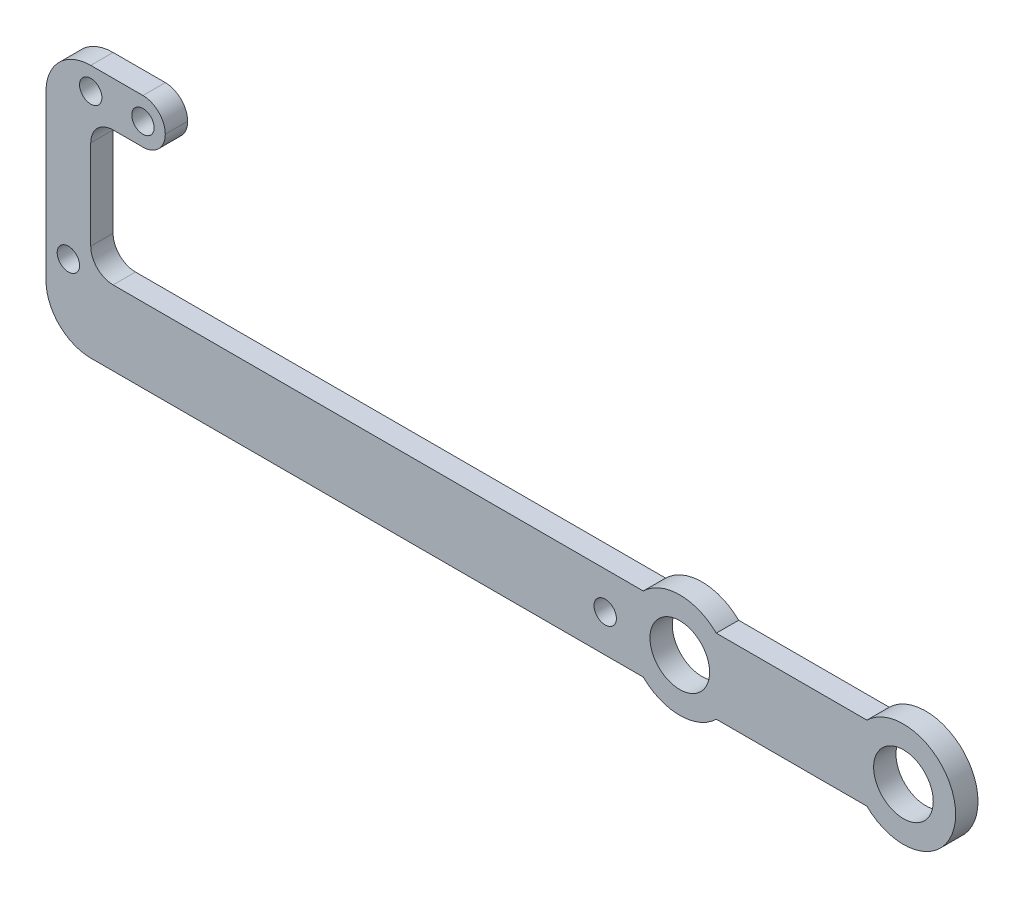
ISO-10303-21;
HEADER;
FILE_DESCRIPTION(('STEP AP214'),'2;1');
FILE_NAME('part.step','',(''),(''),'','','');
FILE_SCHEMA(('AUTOMOTIVE_DESIGN { 1 0 10303 214 1 1 1 1 }'));
ENDSEC;
DATA;
#1=APPLICATION_CONTEXT('core data for automotive mechanical design processes');
#2=APPLICATION_PROTOCOL_DEFINITION('international standard','automotive_design',2000,#1);
#3=PRODUCT_CONTEXT('',#1,'mechanical');
#4=PRODUCT('Part','Part','',(#3));
#5=PRODUCT_RELATED_PRODUCT_CATEGORY('part','',(#4));
#6=PRODUCT_DEFINITION_FORMATION('','',#4);
#7=PRODUCT_DEFINITION_CONTEXT('part definition',#1,'design');
#8=PRODUCT_DEFINITION('design','',#6,#7);
#9=PRODUCT_DEFINITION_SHAPE('','',#8);
#10=(LENGTH_UNIT() NAMED_UNIT(*) SI_UNIT(.MILLI.,.METRE.));
#11=(NAMED_UNIT(*) PLANE_ANGLE_UNIT() SI_UNIT($,.RADIAN.));
#12=(NAMED_UNIT(*) SI_UNIT($,.STERADIAN.) SOLID_ANGLE_UNIT());
#13=UNCERTAINTY_MEASURE_WITH_UNIT(LENGTH_MEASURE(1.E-05),#10,'distance_accuracy_value','');
#14=(GEOMETRIC_REPRESENTATION_CONTEXT(3) GLOBAL_UNCERTAINTY_ASSIGNED_CONTEXT((#13)) GLOBAL_UNIT_ASSIGNED_CONTEXT((#10,
#11,#12)) REPRESENTATION_CONTEXT('',''));
#15=CARTESIAN_POINT('',(0.,0.,0.));
#16=DIRECTION('',(0.,0.,1.));
#17=DIRECTION('',(1.,0.,0.));
#18=AXIS2_PLACEMENT_3D('',#15,#16,#17);
#19=CARTESIAN_POINT('',(0.,0.,3.));
#20=DIRECTION('',(1.,0.,0.));
#21=DIRECTION('',(0.,0.,-1.));
#22=AXIS2_PLACEMENT_3D('',#19,#20,#21);
#23=PLANE('',#22);
#24=DIRECTION('',(0.,-1.,0.));
#25=VECTOR('',#24,1.);
#26=CARTESIAN_POINT('',(0.,0.,0.));
#27=LINE('',#26,#25);
#28=CARTESIAN_POINT('',(0.,28.,0.));
#29=VERTEX_POINT('',#28);
#30=CARTESIAN_POINT('',(0.,6.,0.));
#31=VERTEX_POINT('',#30);
#32=EDGE_CURVE('E206',#29,#31,#27,.T.);
#33=ORIENTED_EDGE('',*,*,#32,.T.);
#34=DIRECTION('',(0.,0.,-1.));
#35=VECTOR('',#34,1.);
#36=CARTESIAN_POINT('',(0.,6.,3.));
#37=LINE('',#36,#35);
#38=CARTESIAN_POINT('',(0.,6.,3.));
#39=VERTEX_POINT('',#38);
#40=EDGE_CURVE('E59',#31,#39,#37,.F.);
#41=ORIENTED_EDGE('',*,*,#40,.T.);
#42=DIRECTION('',(0.,-1.,0.));
#43=VECTOR('',#42,1.);
#44=CARTESIAN_POINT('',(0.,0.,3.));
#45=LINE('',#44,#43);
#46=CARTESIAN_POINT('',(0.,28.,3.));
#47=VERTEX_POINT('',#46);
#48=EDGE_CURVE('E168',#47,#39,#45,.T.);
#49=ORIENTED_EDGE('',*,*,#48,.F.);
#50=DIRECTION('',(0.,0.,-1.));
#51=VECTOR('',#50,1.);
#52=CARTESIAN_POINT('',(0.,28.,3.));
#53=LINE('',#52,#51);
#54=EDGE_CURVE('E285',#47,#29,#53,.T.);
#55=ORIENTED_EDGE('',*,*,#54,.T.);
#56=EDGE_LOOP('',(#33,#41,#49,#55));
#57=FACE_BOUND('',#56,.T.);
#58=ADVANCED_FACE('F37',(#57),#23,.F.);
#59=CARTESIAN_POINT('',(0.,0.,3.));
#60=DIRECTION('',(0.,1.,0.));
#61=DIRECTION('',(0.,0.,1.));
#62=AXIS2_PLACEMENT_3D('',#59,#60,#61);
#63=PLANE('',#62);
#64=DIRECTION('',(1.,0.,0.));
#65=VECTOR('',#64,1.);
#66=CARTESIAN_POINT('',(0.,0.,3.));
#67=LINE('',#66,#65);
#68=CARTESIAN_POINT('',(6.,0.,3.));
#69=VERTEX_POINT('',#68);
#70=CARTESIAN_POINT('',(80.1010205144337,0.,3.));
#71=VERTEX_POINT('',#70);
#72=EDGE_CURVE('E158',#69,#71,#67,.T.);
#73=ORIENTED_EDGE('',*,*,#72,.F.);
#74=DIRECTION('',(0.,0.,-1.));
#75=VECTOR('',#74,1.);
#76=CARTESIAN_POINT('',(6.,0.,3.));
#77=LINE('',#76,#75);
#78=CARTESIAN_POINT('',(6.,0.,0.));
#79=VERTEX_POINT('',#78);
#80=EDGE_CURVE('E276',#69,#79,#77,.T.);
#81=ORIENTED_EDGE('',*,*,#80,.T.);
#82=DIRECTION('',(1.,0.,0.));
#83=VECTOR('',#82,1.);
#84=CARTESIAN_POINT('',(0.,0.,0.));
#85=LINE('',#84,#83);
#86=CARTESIAN_POINT('',(80.1010205144337,0.,0.));
#87=VERTEX_POINT('',#86);
#88=EDGE_CURVE('E174',#79,#87,#85,.T.);
#89=ORIENTED_EDGE('',*,*,#88,.T.);
#90=DIRECTION('',(0.,0.,-1.));
#91=VECTOR('',#90,1.);
#92=CARTESIAN_POINT('',(80.1010205144337,0.,3.));
#93=LINE('',#92,#91);
#94=EDGE_CURVE('E171',#71,#87,#93,.T.);
#95=ORIENTED_EDGE('',*,*,#94,.F.);
#96=EDGE_LOOP('',(#73,#81,#89,#95));
#97=FACE_BOUND('',#96,.T.);
#98=ADVANCED_FACE('F172',(#97),#63,.F.);
#99=CARTESIAN_POINT('',(85.,5.,3.));
#100=DIRECTION('',(0.,0.,-1.));
#101=DIRECTION('',(-1.,0.,0.));
#102=AXIS2_PLACEMENT_3D('',#99,#100,#101);
#103=CYLINDRICAL_SURFACE('',#102,7.);
#104=CARTESIAN_POINT('',(85.,5.,0.));
#105=DIRECTION('',(0.,0.,1.));
#106=DIRECTION('',(1.,0.,0.));
#107=AXIS2_PLACEMENT_3D('',#104,#105,#106);
#108=CIRCLE('',#107,7.);
#109=CARTESIAN_POINT('',(89.8989794855664,0.,0.));
#110=VERTEX_POINT('',#109);
#111=EDGE_CURVE('E210',#87,#110,#108,.T.);
#112=ORIENTED_EDGE('',*,*,#111,.T.);
#113=DIRECTION('',(0.,0.,-1.));
#114=VECTOR('',#113,1.);
#115=CARTESIAN_POINT('',(89.8989794855664,0.,3.));
#116=LINE('',#115,#114);
#117=CARTESIAN_POINT('',(89.8989794855664,0.,3.));
#118=VERTEX_POINT('',#117);
#119=EDGE_CURVE('E178',#118,#110,#116,.T.);
#120=ORIENTED_EDGE('',*,*,#119,.F.);
#121=CARTESIAN_POINT('',(85.,5.,3.));
#122=DIRECTION('',(0.,0.,1.));
#123=DIRECTION('',(1.,0.,0.));
#124=AXIS2_PLACEMENT_3D('',#121,#122,#123);
#125=CIRCLE('',#124,7.);
#126=EDGE_CURVE('E162',#71,#118,#125,.T.);
#127=ORIENTED_EDGE('',*,*,#126,.F.);
#128=ORIENTED_EDGE('',*,*,#94,.T.);
#129=EDGE_LOOP('',(#112,#120,#127,#128));
#130=FACE_BOUND('',#129,.T.);
#131=ADVANCED_FACE('F180',(#130),#103,.T.);
#132=CARTESIAN_POINT('',(89.8989794855664,0.,3.));
#133=DIRECTION('',(0.,1.,0.));
#134=DIRECTION('',(-1.,0.,0.));
#135=AXIS2_PLACEMENT_3D('',#132,#133,#134);
#136=PLANE('',#135);
#137=DIRECTION('',(1.,0.,0.));
#138=VECTOR('',#137,1.);
#139=CARTESIAN_POINT('',(89.8989794855664,0.,0.));
#140=LINE('',#139,#138);
#141=CARTESIAN_POINT('',(110.101020514434,0.,0.));
#142=VERTEX_POINT('',#141);
#143=EDGE_CURVE('E212',#110,#142,#140,.T.);
#144=ORIENTED_EDGE('',*,*,#143,.T.);
#145=DIRECTION('',(0.,0.,-1.));
#146=VECTOR('',#145,1.);
#147=CARTESIAN_POINT('',(110.101020514434,0.,3.));
#148=LINE('',#147,#146);
#149=CARTESIAN_POINT('',(110.101020514434,0.,3.));
#150=VERTEX_POINT('',#149);
#151=EDGE_CURVE('E239',#150,#142,#148,.T.);
#152=ORIENTED_EDGE('',*,*,#151,.F.);
#153=DIRECTION('',(1.,0.,0.));
#154=VECTOR('',#153,1.);
#155=CARTESIAN_POINT('',(89.8989794855664,0.,3.));
#156=LINE('',#155,#154);
#157=EDGE_CURVE('E183',#118,#150,#156,.T.);
#158=ORIENTED_EDGE('',*,*,#157,.F.);
#159=ORIENTED_EDGE('',*,*,#119,.T.);
#160=EDGE_LOOP('',(#144,#152,#158,#159));
#161=FACE_BOUND('',#160,.T.);
#162=ADVANCED_FACE('F349',(#161),#136,.F.);
#163=CARTESIAN_POINT('',(115.,5.,3.));
#164=DIRECTION('',(0.,0.,-1.));
#165=DIRECTION('',(-1.,0.,0.));
#166=AXIS2_PLACEMENT_3D('',#163,#164,#165);
#167=CYLINDRICAL_SURFACE('',#166,7.);
#168=CARTESIAN_POINT('',(115.,5.,0.));
#169=DIRECTION('',(0.,0.,1.));
#170=DIRECTION('',(1.,0.,0.));
#171=AXIS2_PLACEMENT_3D('',#168,#169,#170);
#172=CIRCLE('',#171,7.);
#173=CARTESIAN_POINT('',(110.101020514434,10.,0.));
#174=VERTEX_POINT('',#173);
#175=EDGE_CURVE('E214',#142,#174,#172,.T.);
#176=ORIENTED_EDGE('',*,*,#175,.T.);
#177=DIRECTION('',(0.,0.,-1.));
#178=VECTOR('',#177,1.);
#179=CARTESIAN_POINT('',(110.101020514434,10.,3.));
#180=LINE('',#179,#178);
#181=CARTESIAN_POINT('',(110.101020514434,10.,3.));
#182=VERTEX_POINT('',#181);
#183=EDGE_CURVE('E236',#182,#174,#180,.T.);
#184=ORIENTED_EDGE('',*,*,#183,.F.);
#185=CARTESIAN_POINT('',(115.,5.,3.));
#186=DIRECTION('',(0.,0.,1.));
#187=DIRECTION('',(1.,0.,0.));
#188=AXIS2_PLACEMENT_3D('',#185,#186,#187);
#189=CIRCLE('',#188,7.);
#190=EDGE_CURVE('E185',#150,#182,#189,.T.);
#191=ORIENTED_EDGE('',*,*,#190,.F.);
#192=ORIENTED_EDGE('',*,*,#151,.T.);
#193=EDGE_LOOP('',(#176,#184,#191,#192));
#194=FACE_BOUND('',#193,.T.);
#195=ADVANCED_FACE('F346',(#194),#167,.T.);
#196=CARTESIAN_POINT('',(110.101020514434,10.,3.));
#197=DIRECTION('',(0.,-1.,0.));
#198=DIRECTION('',(1.,0.,0.));
#199=AXIS2_PLACEMENT_3D('',#196,#197,#198);
#200=PLANE('',#199);
#201=DIRECTION('',(-1.,0.,0.));
#202=VECTOR('',#201,1.);
#203=CARTESIAN_POINT('',(110.101020514434,10.,0.));
#204=LINE('',#203,#202);
#205=CARTESIAN_POINT('',(89.8989794855664,10.,0.));
#206=VERTEX_POINT('',#205);
#207=EDGE_CURVE('E216',#174,#206,#204,.T.);
#208=ORIENTED_EDGE('',*,*,#207,.T.);
#209=DIRECTION('',(0.,0.,-1.));
#210=VECTOR('',#209,1.);
#211=CARTESIAN_POINT('',(89.8989794855664,10.,3.));
#212=LINE('',#211,#210);
#213=CARTESIAN_POINT('',(89.8989794855664,10.,3.));
#214=VERTEX_POINT('',#213);
#215=EDGE_CURVE('E233',#214,#206,#212,.T.);
#216=ORIENTED_EDGE('',*,*,#215,.F.);
#217=DIRECTION('',(-1.,0.,0.));
#218=VECTOR('',#217,1.);
#219=CARTESIAN_POINT('',(110.101020514434,10.,3.));
#220=LINE('',#219,#218);
#221=EDGE_CURVE('E190',#182,#214,#220,.T.);
#222=ORIENTED_EDGE('',*,*,#221,.F.);
#223=ORIENTED_EDGE('',*,*,#183,.T.);
#224=EDGE_LOOP('',(#208,#216,#222,#223));
#225=FACE_BOUND('',#224,.T.);
#226=ADVANCED_FACE('F341',(#225),#200,.F.);
#227=CARTESIAN_POINT('',(85.,5.,3.));
#228=DIRECTION('',(0.,0.,-1.));
#229=DIRECTION('',(-1.,0.,0.));
#230=AXIS2_PLACEMENT_3D('',#227,#228,#229);
#231=CYLINDRICAL_SURFACE('',#230,7.);
#232=CARTESIAN_POINT('',(85.,5.,0.));
#233=DIRECTION('',(0.,0.,1.));
#234=DIRECTION('',(1.,0.,0.));
#235=AXIS2_PLACEMENT_3D('',#232,#233,#234);
#236=CIRCLE('',#235,7.);
#237=CARTESIAN_POINT('',(80.1010205144336,10.,0.));
#238=VERTEX_POINT('',#237);
#239=EDGE_CURVE('E218',#206,#238,#236,.T.);
#240=ORIENTED_EDGE('',*,*,#239,.T.);
#241=DIRECTION('',(0.,0.,-1.));
#242=VECTOR('',#241,1.);
#243=CARTESIAN_POINT('',(80.1010205144336,10.,3.));
#244=LINE('',#243,#242);
#245=CARTESIAN_POINT('',(80.1010205144336,10.,3.));
#246=VERTEX_POINT('',#245);
#247=EDGE_CURVE('E205',#246,#238,#244,.T.);
#248=ORIENTED_EDGE('',*,*,#247,.F.);
#249=CARTESIAN_POINT('',(85.,5.,3.));
#250=DIRECTION('',(0.,0.,1.));
#251=DIRECTION('',(1.,0.,0.));
#252=AXIS2_PLACEMENT_3D('',#249,#250,#251);
#253=CIRCLE('',#252,7.);
#254=EDGE_CURVE('E192',#214,#246,#253,.T.);
#255=ORIENTED_EDGE('',*,*,#254,.F.);
#256=ORIENTED_EDGE('',*,*,#215,.T.);
#257=EDGE_LOOP('',(#240,#248,#255,#256));
#258=FACE_BOUND('',#257,.T.);
#259=ADVANCED_FACE('F335',(#258),#231,.T.);
#260=CARTESIAN_POINT('',(80.1010205144336,10.,3.));
#261=DIRECTION('',(0.,-1.,0.));
#262=DIRECTION('',(1.,0.,0.));
#263=AXIS2_PLACEMENT_3D('',#260,#261,#262);
#264=PLANE('',#263);
#265=DIRECTION('',(-1.,0.,0.));
#266=VECTOR('',#265,1.);
#267=CARTESIAN_POINT('',(80.1010205144336,10.,0.));
#268=LINE('',#267,#266);
#269=CARTESIAN_POINT('',(9.00000000000004,9.99999999999999,0.));
#270=VERTEX_POINT('',#269);
#271=EDGE_CURVE('E220',#238,#270,#268,.T.);
#272=ORIENTED_EDGE('',*,*,#271,.T.);
#273=DIRECTION('',(0.,0.,-1.));
#274=VECTOR('',#273,1.);
#275=CARTESIAN_POINT('',(9.00000000000001,9.99999999999999,3.));
#276=LINE('',#275,#274);
#277=CARTESIAN_POINT('',(9.00000000000004,9.99999999999999,3.));
#278=VERTEX_POINT('',#277);
#279=EDGE_CURVE('E250',#270,#278,#276,.F.);
#280=ORIENTED_EDGE('',*,*,#279,.T.);
#281=DIRECTION('',(-1.,0.,0.));
#282=VECTOR('',#281,1.);
#283=CARTESIAN_POINT('',(80.1010205144336,10.,3.));
#284=LINE('',#283,#282);
#285=EDGE_CURVE('E194',#246,#278,#284,.T.);
#286=ORIENTED_EDGE('',*,*,#285,.F.);
#287=ORIENTED_EDGE('',*,*,#247,.T.);
#288=EDGE_LOOP('',(#272,#280,#286,#287));
#289=FACE_BOUND('',#288,.T.);
#290=ADVANCED_FACE('F330',(#289),#264,.F.);
#291=CARTESIAN_POINT('',(6.,28.,3.));
#292=DIRECTION('',(-1.,0.,0.));
#293=DIRECTION('',(0.,-1.,0.));
#294=AXIS2_PLACEMENT_3D('',#291,#292,#293);
#295=PLANE('',#294);
#296=DIRECTION('',(0.,1.,0.));
#297=VECTOR('',#296,1.);
#298=CARTESIAN_POINT('',(6.,28.,3.));
#299=LINE('',#298,#297);
#300=CARTESIAN_POINT('',(6.00000000000001,13.,3.));
#301=VERTEX_POINT('',#300);
#302=CARTESIAN_POINT('',(6.,25.,3.));
#303=VERTEX_POINT('',#302);
#304=EDGE_CURVE('E197',#301,#303,#299,.T.);
#305=ORIENTED_EDGE('',*,*,#304,.F.);
#306=DIRECTION('',(0.,0.,-1.));
#307=VECTOR('',#306,1.);
#308=CARTESIAN_POINT('',(6.00000000000001,13.,0.));
#309=LINE('',#308,#307);
#310=CARTESIAN_POINT('',(6.00000000000001,13.,0.));
#311=VERTEX_POINT('',#310);
#312=EDGE_CURVE('E247',#301,#311,#309,.T.);
#313=ORIENTED_EDGE('',*,*,#312,.T.);
#314=DIRECTION('',(0.,1.,0.));
#315=VECTOR('',#314,1.);
#316=CARTESIAN_POINT('',(6.,28.,0.));
#317=LINE('',#316,#315);
#318=CARTESIAN_POINT('',(6.,25.,0.));
#319=VERTEX_POINT('',#318);
#320=EDGE_CURVE('E223',#311,#319,#317,.T.);
#321=ORIENTED_EDGE('',*,*,#320,.T.);
#322=DIRECTION('',(0.,0.,-1.));
#323=VECTOR('',#322,1.);
#324=CARTESIAN_POINT('',(6.,25.,3.));
#325=LINE('',#324,#323);
#326=EDGE_CURVE('E177',#319,#303,#325,.F.);
#327=ORIENTED_EDGE('',*,*,#326,.T.);
#328=EDGE_LOOP('',(#305,#313,#321,#327));
#329=FACE_BOUND('',#328,.T.);
#330=ADVANCED_FACE('F321',(#329),#295,.F.);
#331=CARTESIAN_POINT('',(16.,28.,3.));
#332=DIRECTION('',(0.,1.,0.));
#333=DIRECTION('',(-1.,0.,0.));
#334=AXIS2_PLACEMENT_3D('',#331,#332,#333);
#335=PLANE('',#334);
#336=DIRECTION('',(1.,0.,0.));
#337=VECTOR('',#336,1.);
#338=CARTESIAN_POINT('',(16.,28.,0.));
#339=LINE('',#338,#337);
#340=CARTESIAN_POINT('',(9.00000000000001,28.,0.));
#341=VERTEX_POINT('',#340);
#342=CARTESIAN_POINT('',(13.,28.,0.));
#343=VERTEX_POINT('',#342);
#344=EDGE_CURVE('E226',#341,#343,#339,.T.);
#345=ORIENTED_EDGE('',*,*,#344,.T.);
#346=DIRECTION('',(0.,0.,-1.));
#347=VECTOR('',#346,1.);
#348=CARTESIAN_POINT('',(13.,28.,3.));
#349=LINE('',#348,#347);
#350=CARTESIAN_POINT('',(13.,28.,3.));
#351=VERTEX_POINT('',#350);
#352=EDGE_CURVE('E266',#343,#351,#349,.F.);
#353=ORIENTED_EDGE('',*,*,#352,.T.);
#354=DIRECTION('',(1.,0.,0.));
#355=VECTOR('',#354,1.);
#356=CARTESIAN_POINT('',(16.,28.,3.));
#357=LINE('',#356,#355);
#358=CARTESIAN_POINT('',(9.00000000000001,28.,3.));
#359=VERTEX_POINT('',#358);
#360=EDGE_CURVE('E200',#359,#351,#357,.T.);
#361=ORIENTED_EDGE('',*,*,#360,.F.);
#362=DIRECTION('',(0.,0.,-1.));
#363=VECTOR('',#362,1.);
#364=CARTESIAN_POINT('',(9.00000000000001,28.,0.));
#365=LINE('',#364,#363);
#366=EDGE_CURVE('E263',#359,#341,#365,.T.);
#367=ORIENTED_EDGE('',*,*,#366,.T.);
#368=EDGE_LOOP('',(#345,#353,#361,#367));
#369=FACE_BOUND('',#368,.T.);
#370=ADVANCED_FACE('F312',(#369),#335,.F.);
#371=CARTESIAN_POINT('',(0.,34.,3.));
#372=DIRECTION('',(0.,-1.,0.));
#373=DIRECTION('',(0.,0.,-1.));
#374=AXIS2_PLACEMENT_3D('',#371,#372,#373);
#375=PLANE('',#374);
#376=DIRECTION('',(-1.,0.,0.));
#377=VECTOR('',#376,1.);
#378=CARTESIAN_POINT('',(0.,34.,0.));
#379=LINE('',#378,#377);
#380=CARTESIAN_POINT('',(13.,34.,0.));
#381=VERTEX_POINT('',#380);
#382=CARTESIAN_POINT('',(6.,34.,0.));
#383=VERTEX_POINT('',#382);
#384=EDGE_CURVE('E229',#381,#383,#379,.T.);
#385=ORIENTED_EDGE('',*,*,#384,.T.);
#386=DIRECTION('',(0.,0.,-1.));
#387=VECTOR('',#386,1.);
#388=CARTESIAN_POINT('',(6.,34.,3.));
#389=LINE('',#388,#387);
#390=CARTESIAN_POINT('',(6.,34.,3.));
#391=VERTEX_POINT('',#390);
#392=EDGE_CURVE('E11',#383,#391,#389,.F.);
#393=ORIENTED_EDGE('',*,*,#392,.T.);
#394=DIRECTION('',(-1.,0.,0.));
#395=VECTOR('',#394,1.);
#396=CARTESIAN_POINT('',(0.,34.,3.));
#397=LINE('',#396,#395);
#398=CARTESIAN_POINT('',(13.,34.,3.));
#399=VERTEX_POINT('',#398);
#400=EDGE_CURVE('E203',#399,#391,#397,.T.);
#401=ORIENTED_EDGE('',*,*,#400,.F.);
#402=DIRECTION('',(0.,0.,-1.));
#403=VECTOR('',#402,1.);
#404=CARTESIAN_POINT('',(13.,34.,3.));
#405=LINE('',#404,#403);
#406=EDGE_CURVE('E252',#399,#381,#405,.T.);
#407=ORIENTED_EDGE('',*,*,#406,.T.);
#408=EDGE_LOOP('',(#385,#393,#401,#407));
#409=FACE_BOUND('',#408,.T.);
#410=ADVANCED_FACE('F298',(#409),#375,.F.);
#411=CARTESIAN_POINT('',(85.,5.,3.));
#412=DIRECTION('',(0.,0.,1.));
#413=DIRECTION('',(1.,0.,0.));
#414=AXIS2_PLACEMENT_3D('',#411,#412,#413);
#415=PLANE('',#414);
#416=CARTESIAN_POINT('',(3.,10.,3.));
#417=DIRECTION('',(0.,0.,1.));
#418=DIRECTION('',(1.,0.,0.));
#419=AXIS2_PLACEMENT_3D('',#416,#417,#418);
#420=CIRCLE('',#419,1.5);
#421=CARTESIAN_POINT('',(4.5,10.,3.));
#422=VERTEX_POINT('',#421);
#423=EDGE_CURVE('E583',#422,#422,#420,.F.);
#424=ORIENTED_EDGE('',*,*,#423,.T.);
#425=EDGE_LOOP('',(#424));
#426=FACE_BOUND('',#425,.T.);
#427=CARTESIAN_POINT('',(13.,31.,3.));
#428=DIRECTION('',(0.,0.,1.));
#429=DIRECTION('',(1.,0.,0.));
#430=AXIS2_PLACEMENT_3D('',#427,#428,#429);
#431=CIRCLE('',#430,1.5);
#432=CARTESIAN_POINT('',(14.5,31.,3.));
#433=VERTEX_POINT('',#432);
#434=EDGE_CURVE('E586',#433,#433,#431,.F.);
#435=ORIENTED_EDGE('',*,*,#434,.T.);
#436=EDGE_LOOP('',(#435));
#437=FACE_BOUND('',#436,.T.);
#438=CARTESIAN_POINT('',(6.,31.,3.));
#439=DIRECTION('',(0.,0.,1.));
#440=DIRECTION('',(1.,0.,0.));
#441=AXIS2_PLACEMENT_3D('',#438,#439,#440);
#442=CIRCLE('',#441,1.5);
#443=CARTESIAN_POINT('',(7.5,31.,3.));
#444=VERTEX_POINT('',#443);
#445=EDGE_CURVE('E589',#444,#444,#442,.F.);
#446=ORIENTED_EDGE('',*,*,#445,.T.);
#447=EDGE_LOOP('',(#446));
#448=FACE_BOUND('',#447,.T.);
#449=CARTESIAN_POINT('',(75.,5.,3.));
#450=DIRECTION('',(0.,0.,1.));
#451=DIRECTION('',(1.,0.,0.));
#452=AXIS2_PLACEMENT_3D('',#449,#450,#451);
#453=CIRCLE('',#452,1.5);
#454=CARTESIAN_POINT('',(76.5,5.,3.));
#455=VERTEX_POINT('',#454);
#456=EDGE_CURVE('E577',#455,#455,#453,.F.);
#457=ORIENTED_EDGE('',*,*,#456,.T.);
#458=EDGE_LOOP('',(#457));
#459=FACE_BOUND('',#458,.T.);
#460=CARTESIAN_POINT('',(85.,5.00000000000001,3.));
#461=DIRECTION('',(0.,0.,1.));
#462=DIRECTION('',(1.,0.,0.));
#463=AXIS2_PLACEMENT_3D('',#460,#461,#462);
#464=CIRCLE('',#463,4.00000000000001);
#465=CARTESIAN_POINT('',(89.,5.00000000000001,3.));
#466=VERTEX_POINT('',#465);
#467=EDGE_CURVE('E574',#466,#466,#464,.T.);
#468=ORIENTED_EDGE('',*,*,#467,.F.);
#469=EDGE_LOOP('',(#468));
#470=FACE_BOUND('',#469,.T.);
#471=CARTESIAN_POINT('',(115.,5.,3.));
#472=DIRECTION('',(0.,0.,1.));
#473=DIRECTION('',(1.,0.,0.));
#474=AXIS2_PLACEMENT_3D('',#471,#472,#473);
#475=CIRCLE('',#474,4.00000000000001);
#476=CARTESIAN_POINT('',(119.,5.,3.));
#477=VERTEX_POINT('',#476);
#478=EDGE_CURVE('E245',#477,#477,#475,.T.);
#479=ORIENTED_EDGE('',*,*,#478,.F.);
#480=EDGE_LOOP('',(#479));
#481=FACE_BOUND('',#480,.T.);
#482=ORIENTED_EDGE('',*,*,#48,.T.);
#483=CARTESIAN_POINT('',(6.,6.,3.));
#484=DIRECTION('',(0.,0.,1.));
#485=DIRECTION('',(1.,0.,0.));
#486=AXIS2_PLACEMENT_3D('',#483,#484,#485);
#487=CIRCLE('',#486,6.);
#488=EDGE_CURVE('E46',#39,#69,#487,.T.);
#489=ORIENTED_EDGE('',*,*,#488,.T.);
#490=ORIENTED_EDGE('',*,*,#72,.T.);
#491=ORIENTED_EDGE('',*,*,#126,.T.);
#492=ORIENTED_EDGE('',*,*,#157,.T.);
#493=ORIENTED_EDGE('',*,*,#190,.T.);
#494=ORIENTED_EDGE('',*,*,#221,.T.);
#495=ORIENTED_EDGE('',*,*,#254,.T.);
#496=ORIENTED_EDGE('',*,*,#285,.T.);
#497=CARTESIAN_POINT('',(9.00000000000001,13.,3.));
#498=DIRECTION('',(0.,0.,1.));
#499=DIRECTION('',(1.,0.,0.));
#500=AXIS2_PLACEMENT_3D('',#497,#498,#499);
#501=CIRCLE('',#500,3.);
#502=EDGE_CURVE('E270',#278,#301,#501,.F.);
#503=ORIENTED_EDGE('',*,*,#502,.T.);
#504=ORIENTED_EDGE('',*,*,#304,.T.);
#505=CARTESIAN_POINT('',(9.00000000000001,25.,3.));
#506=DIRECTION('',(0.,0.,1.));
#507=DIRECTION('',(1.,0.,0.));
#508=AXIS2_PLACEMENT_3D('',#505,#506,#507);
#509=CIRCLE('',#508,3.);
#510=EDGE_CURVE('E274',#303,#359,#509,.F.);
#511=ORIENTED_EDGE('',*,*,#510,.T.);
#512=ORIENTED_EDGE('',*,*,#360,.T.);
#513=CARTESIAN_POINT('',(13.,31.,3.));
#514=DIRECTION('',(0.,0.,1.));
#515=DIRECTION('',(1.,0.,0.));
#516=AXIS2_PLACEMENT_3D('',#513,#514,#515);
#517=CIRCLE('',#516,3.);
#518=CARTESIAN_POINT('',(16.,31.,3.));
#519=VERTEX_POINT('',#518);
#520=EDGE_CURVE('E259',#351,#519,#517,.T.);
#521=ORIENTED_EDGE('',*,*,#520,.T.);
#522=CARTESIAN_POINT('',(13.,31.,3.));
#523=DIRECTION('',(0.,0.,1.));
#524=DIRECTION('',(1.,0.,0.));
#525=AXIS2_PLACEMENT_3D('',#522,#523,#524);
#526=CIRCLE('',#525,3.);
#527=EDGE_CURVE('E261',#519,#399,#526,.T.);
#528=ORIENTED_EDGE('',*,*,#527,.T.);
#529=ORIENTED_EDGE('',*,*,#400,.T.);
#530=CARTESIAN_POINT('',(6.,28.,3.));
#531=DIRECTION('',(0.,0.,1.));
#532=DIRECTION('',(1.,0.,0.));
#533=AXIS2_PLACEMENT_3D('',#530,#531,#532);
#534=CIRCLE('',#533,6.);
#535=EDGE_CURVE('E289',#391,#47,#534,.T.);
#536=ORIENTED_EDGE('',*,*,#535,.T.);
#537=EDGE_LOOP('',(#482,#489,#490,#491,#492,#493,#494,#495,#496,#503,#504,#511,#512,#521,#528,
#529,#536));
#538=FACE_BOUND('',#537,.T.);
#539=ADVANCED_FACE('F160',(#426,#437,#448,#459,#470,#481,#538),#415,.T.);
#540=CARTESIAN_POINT('',(85.,5.,0.));
#541=DIRECTION('',(0.,0.,1.));
#542=DIRECTION('',(1.,0.,0.));
#543=AXIS2_PLACEMENT_3D('',#540,#541,#542);
#544=PLANE('',#543);
#545=CARTESIAN_POINT('',(3.,10.,0.));
#546=DIRECTION('',(0.,0.,1.));
#547=DIRECTION('',(1.,0.,0.));
#548=AXIS2_PLACEMENT_3D('',#545,#546,#547);
#549=CIRCLE('',#548,1.5);
#550=CARTESIAN_POINT('',(4.5,10.,0.));
#551=VERTEX_POINT('',#550);
#552=EDGE_CURVE('E592',#551,#551,#549,.T.);
#553=ORIENTED_EDGE('',*,*,#552,.T.);
#554=EDGE_LOOP('',(#553));
#555=FACE_BOUND('',#554,.T.);
#556=CARTESIAN_POINT('',(13.,31.,0.));
#557=DIRECTION('',(0.,0.,1.));
#558=DIRECTION('',(1.,0.,0.));
#559=AXIS2_PLACEMENT_3D('',#556,#557,#558);
#560=CIRCLE('',#559,1.5);
#561=CARTESIAN_POINT('',(14.5,31.,0.));
#562=VERTEX_POINT('',#561);
#563=EDGE_CURVE('E596',#562,#562,#560,.T.);
#564=ORIENTED_EDGE('',*,*,#563,.T.);
#565=EDGE_LOOP('',(#564));
#566=FACE_BOUND('',#565,.T.);
#567=CARTESIAN_POINT('',(6.,31.,0.));
#568=DIRECTION('',(0.,0.,1.));
#569=DIRECTION('',(1.,0.,0.));
#570=AXIS2_PLACEMENT_3D('',#567,#568,#569);
#571=CIRCLE('',#570,1.5);
#572=CARTESIAN_POINT('',(7.5,31.,0.));
#573=VERTEX_POINT('',#572);
#574=EDGE_CURVE('E593',#573,#573,#571,.T.);
#575=ORIENTED_EDGE('',*,*,#574,.T.);
#576=EDGE_LOOP('',(#575));
#577=FACE_BOUND('',#576,.T.);
#578=CARTESIAN_POINT('',(75.,5.,0.));
#579=DIRECTION('',(0.,0.,1.));
#580=DIRECTION('',(1.,0.,0.));
#581=AXIS2_PLACEMENT_3D('',#578,#579,#580);
#582=CIRCLE('',#581,1.5);
#583=CARTESIAN_POINT('',(76.5,5.,0.));
#584=VERTEX_POINT('',#583);
#585=EDGE_CURVE('E580',#584,#584,#582,.T.);
#586=ORIENTED_EDGE('',*,*,#585,.T.);
#587=EDGE_LOOP('',(#586));
#588=FACE_BOUND('',#587,.T.);
#589=CARTESIAN_POINT('',(85.,5.00000000000001,0.));
#590=DIRECTION('',(0.,0.,1.));
#591=DIRECTION('',(1.,0.,0.));
#592=AXIS2_PLACEMENT_3D('',#589,#590,#591);
#593=CIRCLE('',#592,4.00000000000001);
#594=CARTESIAN_POINT('',(89.,5.00000000000001,0.));
#595=VERTEX_POINT('',#594);
#596=EDGE_CURVE('E41',#595,#595,#593,.T.);
#597=ORIENTED_EDGE('',*,*,#596,.T.);
#598=EDGE_LOOP('',(#597));
#599=FACE_BOUND('',#598,.T.);
#600=CARTESIAN_POINT('',(115.,5.,0.));
#601=DIRECTION('',(0.,0.,1.));
#602=DIRECTION('',(1.,0.,0.));
#603=AXIS2_PLACEMENT_3D('',#600,#601,#602);
#604=CIRCLE('',#603,4.00000000000001);
#605=CARTESIAN_POINT('',(119.,5.,0.));
#606=VERTEX_POINT('',#605);
#607=EDGE_CURVE('E208',#606,#606,#604,.F.);
#608=ORIENTED_EDGE('',*,*,#607,.F.);
#609=EDGE_LOOP('',(#608));
#610=FACE_BOUND('',#609,.T.);
#611=ORIENTED_EDGE('',*,*,#88,.F.);
#612=CARTESIAN_POINT('',(6.,6.,0.));
#613=DIRECTION('',(0.,0.,1.));
#614=DIRECTION('',(1.,0.,0.));
#615=AXIS2_PLACEMENT_3D('',#612,#613,#614);
#616=CIRCLE('',#615,6.);
#617=EDGE_CURVE('E283',#79,#31,#616,.F.);
#618=ORIENTED_EDGE('',*,*,#617,.T.);
#619=ORIENTED_EDGE('',*,*,#32,.F.);
#620=CARTESIAN_POINT('',(6.,28.,0.));
#621=DIRECTION('',(0.,0.,1.));
#622=DIRECTION('',(1.,0.,0.));
#623=AXIS2_PLACEMENT_3D('',#620,#621,#622);
#624=CIRCLE('',#623,6.);
#625=EDGE_CURVE('E281',#29,#383,#624,.F.);
#626=ORIENTED_EDGE('',*,*,#625,.T.);
#627=ORIENTED_EDGE('',*,*,#384,.F.);
#628=CARTESIAN_POINT('',(13.,31.,0.));
#629=DIRECTION('',(0.,0.,1.));
#630=DIRECTION('',(1.,0.,0.));
#631=AXIS2_PLACEMENT_3D('',#628,#629,#630);
#632=CIRCLE('',#631,3.);
#633=CARTESIAN_POINT('',(16.,31.,0.));
#634=VERTEX_POINT('',#633);
#635=EDGE_CURVE('E257',#381,#634,#632,.F.);
#636=ORIENTED_EDGE('',*,*,#635,.T.);
#637=CARTESIAN_POINT('',(13.,31.,0.));
#638=DIRECTION('',(0.,0.,1.));
#639=DIRECTION('',(1.,0.,0.));
#640=AXIS2_PLACEMENT_3D('',#637,#638,#639);
#641=CIRCLE('',#640,3.);
#642=EDGE_CURVE('E255',#634,#343,#641,.F.);
#643=ORIENTED_EDGE('',*,*,#642,.T.);
#644=ORIENTED_EDGE('',*,*,#344,.F.);
#645=CARTESIAN_POINT('',(9.00000000000001,25.,0.));
#646=DIRECTION('',(0.,0.,1.));
#647=DIRECTION('',(1.,0.,0.));
#648=AXIS2_PLACEMENT_3D('',#645,#646,#647);
#649=CIRCLE('',#648,3.);
#650=EDGE_CURVE('E272',#341,#319,#649,.T.);
#651=ORIENTED_EDGE('',*,*,#650,.T.);
#652=ORIENTED_EDGE('',*,*,#320,.F.);
#653=CARTESIAN_POINT('',(9.00000000000001,13.,0.));
#654=DIRECTION('',(0.,0.,1.));
#655=DIRECTION('',(1.,0.,0.));
#656=AXIS2_PLACEMENT_3D('',#653,#654,#655);
#657=CIRCLE('',#656,3.);
#658=EDGE_CURVE('E268',#311,#270,#657,.T.);
#659=ORIENTED_EDGE('',*,*,#658,.T.);
#660=ORIENTED_EDGE('',*,*,#271,.F.);
#661=ORIENTED_EDGE('',*,*,#239,.F.);
#662=ORIENTED_EDGE('',*,*,#207,.F.);
#663=ORIENTED_EDGE('',*,*,#175,.F.);
#664=ORIENTED_EDGE('',*,*,#143,.F.);
#665=ORIENTED_EDGE('',*,*,#111,.F.);
#666=EDGE_LOOP('',(#611,#618,#619,#626,#627,#636,#643,#644,#651,#652,#659,#660,#661,#662,#663,
#664,#665));
#667=FACE_BOUND('',#666,.T.);
#668=ADVANCED_FACE('F297',(#555,#566,#577,#588,#599,#610,#667),#544,.F.);
#669=CARTESIAN_POINT('',(115.,5.,3.));
#670=DIRECTION('',(0.,0.,-1.));
#671=DIRECTION('',(-1.,0.,0.));
#672=AXIS2_PLACEMENT_3D('',#669,#670,#671);
#673=CYLINDRICAL_SURFACE('',#672,4.00000000000001);
#674=ORIENTED_EDGE('',*,*,#478,.T.);
#675=EDGE_LOOP('',(#674));
#676=FACE_BOUND('',#675,.T.);
#677=ORIENTED_EDGE('',*,*,#607,.T.);
#678=EDGE_LOOP('',(#677));
#679=FACE_BOUND('',#678,.T.);
#680=ADVANCED_FACE('F369',(#676,#679),#673,.F.);
#681=CARTESIAN_POINT('',(9.00000000000001,13.,3.));
#682=DIRECTION('',(0.,0.,1.));
#683=DIRECTION('',(1.,0.,0.));
#684=AXIS2_PLACEMENT_3D('',#681,#682,#683);
#685=CYLINDRICAL_SURFACE('',#684,3.);
#686=ORIENTED_EDGE('',*,*,#502,.F.);
#687=ORIENTED_EDGE('',*,*,#279,.F.);
#688=ORIENTED_EDGE('',*,*,#658,.F.);
#689=ORIENTED_EDGE('',*,*,#312,.F.);
#690=EDGE_LOOP('',(#686,#687,#688,#689));
#691=FACE_BOUND('',#690,.T.);
#692=ADVANCED_FACE('F325',(#691),#685,.F.);
#693=CARTESIAN_POINT('',(13.,31.,3.));
#694=DIRECTION('',(0.,0.,-1.));
#695=DIRECTION('',(-1.,0.,0.));
#696=AXIS2_PLACEMENT_3D('',#693,#694,#695);
#697=CYLINDRICAL_SURFACE('',#696,3.);
#698=DIRECTION('',(0.,0.,-1.));
#699=VECTOR('',#698,1.);
#700=CARTESIAN_POINT('',(16.,31.,3.));
#701=LINE('',#700,#699);
#702=EDGE_CURVE('E277',#519,#634,#701,.T.);
#703=ORIENTED_EDGE('',*,*,#702,.F.);
#704=ORIENTED_EDGE('',*,*,#520,.F.);
#705=ORIENTED_EDGE('',*,*,#352,.F.);
#706=ORIENTED_EDGE('',*,*,#642,.F.);
#707=EDGE_LOOP('',(#703,#704,#705,#706));
#708=FACE_BOUND('',#707,.T.);
#709=ADVANCED_FACE('F308',(#708),#697,.T.);
#710=CARTESIAN_POINT('',(13.,31.,3.));
#711=DIRECTION('',(0.,0.,-1.));
#712=DIRECTION('',(-1.,0.,0.));
#713=AXIS2_PLACEMENT_3D('',#710,#711,#712);
#714=CYLINDRICAL_SURFACE('',#713,3.);
#715=ORIENTED_EDGE('',*,*,#527,.F.);
#716=ORIENTED_EDGE('',*,*,#702,.T.);
#717=ORIENTED_EDGE('',*,*,#635,.F.);
#718=ORIENTED_EDGE('',*,*,#406,.F.);
#719=EDGE_LOOP('',(#715,#716,#717,#718));
#720=FACE_BOUND('',#719,.T.);
#721=ADVANCED_FACE('F302',(#720),#714,.T.);
#722=CARTESIAN_POINT('',(9.00000000000001,25.,3.));
#723=DIRECTION('',(0.,0.,1.));
#724=DIRECTION('',(1.,0.,0.));
#725=AXIS2_PLACEMENT_3D('',#722,#723,#724);
#726=CYLINDRICAL_SURFACE('',#725,3.);
#727=ORIENTED_EDGE('',*,*,#510,.F.);
#728=ORIENTED_EDGE('',*,*,#326,.F.);
#729=ORIENTED_EDGE('',*,*,#650,.F.);
#730=ORIENTED_EDGE('',*,*,#366,.F.);
#731=EDGE_LOOP('',(#727,#728,#729,#730));
#732=FACE_BOUND('',#731,.T.);
#733=ADVANCED_FACE('F318',(#732),#726,.F.);
#734=CARTESIAN_POINT('',(6.,6.,3.));
#735=DIRECTION('',(0.,0.,-1.));
#736=DIRECTION('',(-1.,0.,0.));
#737=AXIS2_PLACEMENT_3D('',#734,#735,#736);
#738=CYLINDRICAL_SURFACE('',#737,6.);
#739=ORIENTED_EDGE('',*,*,#488,.F.);
#740=ORIENTED_EDGE('',*,*,#40,.F.);
#741=ORIENTED_EDGE('',*,*,#617,.F.);
#742=ORIENTED_EDGE('',*,*,#80,.F.);
#743=EDGE_LOOP('',(#739,#740,#741,#742));
#744=FACE_BOUND('',#743,.T.);
#745=ADVANCED_FACE('F351',(#744),#738,.T.);
#746=CARTESIAN_POINT('',(6.,28.,3.));
#747=DIRECTION('',(0.,0.,-1.));
#748=DIRECTION('',(-1.,0.,0.));
#749=AXIS2_PLACEMENT_3D('',#746,#747,#748);
#750=CYLINDRICAL_SURFACE('',#749,6.);
#751=ORIENTED_EDGE('',*,*,#535,.F.);
#752=ORIENTED_EDGE('',*,*,#392,.F.);
#753=ORIENTED_EDGE('',*,*,#625,.F.);
#754=ORIENTED_EDGE('',*,*,#54,.F.);
#755=EDGE_LOOP('',(#751,#752,#753,#754));
#756=FACE_BOUND('',#755,.T.);
#757=ADVANCED_FACE('F39',(#756),#750,.T.);
#758=CARTESIAN_POINT('',(85.,5.00000000000001,-1.));
#759=DIRECTION('',(0.,0.,1.));
#760=DIRECTION('',(1.,0.,0.));
#761=AXIS2_PLACEMENT_3D('',#758,#759,#760);
#762=CYLINDRICAL_SURFACE('',#761,4.00000000000001);
#763=ORIENTED_EDGE('',*,*,#467,.T.);
#764=EDGE_LOOP('',(#763));
#765=FACE_BOUND('',#764,.T.);
#766=ORIENTED_EDGE('',*,*,#596,.F.);
#767=EDGE_LOOP('',(#766));
#768=FACE_BOUND('',#767,.T.);
#769=ADVANCED_FACE('F357',(#765,#768),#762,.F.);
#770=CARTESIAN_POINT('',(75.,5.,10.));
#771=DIRECTION('',(0.,0.,-1.));
#772=DIRECTION('',(-1.,0.,0.));
#773=AXIS2_PLACEMENT_3D('',#770,#771,#772);
#774=CYLINDRICAL_SURFACE('',#773,1.5);
#775=ORIENTED_EDGE('',*,*,#456,.F.);
#776=EDGE_LOOP('',(#775));
#777=FACE_BOUND('',#776,.T.);
#778=ORIENTED_EDGE('',*,*,#585,.F.);
#779=EDGE_LOOP('',(#778));
#780=FACE_BOUND('',#779,.T.);
#781=ADVANCED_FACE('F429',(#777,#780),#774,.F.);
#782=CARTESIAN_POINT('',(6.,31.,10.));
#783=DIRECTION('',(0.,0.,-1.));
#784=DIRECTION('',(-1.,0.,0.));
#785=AXIS2_PLACEMENT_3D('',#782,#783,#784);
#786=CYLINDRICAL_SURFACE('',#785,1.5);
#787=ORIENTED_EDGE('',*,*,#445,.F.);
#788=EDGE_LOOP('',(#787));
#789=FACE_BOUND('',#788,.T.);
#790=ORIENTED_EDGE('',*,*,#574,.F.);
#791=EDGE_LOOP('',(#790));
#792=FACE_BOUND('',#791,.T.);
#793=ADVANCED_FACE('F456',(#789,#792),#786,.F.);
#794=CARTESIAN_POINT('',(13.,31.,10.));
#795=DIRECTION('',(0.,0.,-1.));
#796=DIRECTION('',(-1.,0.,0.));
#797=AXIS2_PLACEMENT_3D('',#794,#795,#796);
#798=CYLINDRICAL_SURFACE('',#797,1.5);
#799=ORIENTED_EDGE('',*,*,#434,.F.);
#800=EDGE_LOOP('',(#799));
#801=FACE_BOUND('',#800,.T.);
#802=ORIENTED_EDGE('',*,*,#563,.F.);
#803=EDGE_LOOP('',(#802));
#804=FACE_BOUND('',#803,.T.);
#805=ADVANCED_FACE('F466',(#801,#804),#798,.F.);
#806=CARTESIAN_POINT('',(3.,10.,10.));
#807=DIRECTION('',(0.,0.,-1.));
#808=DIRECTION('',(-1.,0.,0.));
#809=AXIS2_PLACEMENT_3D('',#806,#807,#808);
#810=CYLINDRICAL_SURFACE('',#809,1.5);
#811=ORIENTED_EDGE('',*,*,#423,.F.);
#812=EDGE_LOOP('',(#811));
#813=FACE_BOUND('',#812,.T.);
#814=ORIENTED_EDGE('',*,*,#552,.F.);
#815=EDGE_LOOP('',(#814));
#816=FACE_BOUND('',#815,.T.);
#817=ADVANCED_FACE('F476',(#813,#816),#810,.F.);
#818=CLOSED_SHELL('',(#58,#98,#131,#162,#195,#226,#259,#290,#330,#370,#410,#539,#668,#680,#692,
#709,#721,#733,#745,#757,#769,#781,#793,#805,#817));
#819=MANIFOLD_SOLID_BREP('B2',#818);
#820=ADVANCED_BREP_SHAPE_REPRESENTATION('',(#18,#819),#14);
#821=SHAPE_DEFINITION_REPRESENTATION(#9,#820);
ENDSEC;
END-ISO-10303-21;
